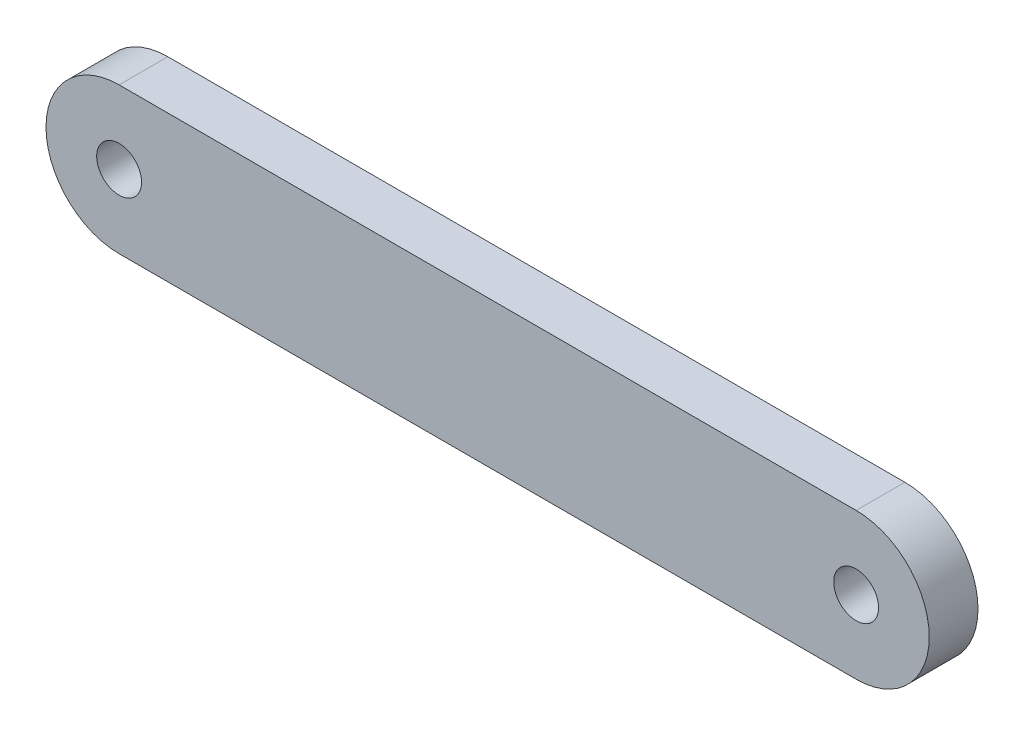
ISO-10303-21;
HEADER;
FILE_DESCRIPTION(('STEP AP214'),'2;1');
FILE_NAME('part.step','',(''),(''),'','','');
FILE_SCHEMA(('AUTOMOTIVE_DESIGN { 1 0 10303 214 1 1 1 1 }'));
ENDSEC;
DATA;
#1=APPLICATION_CONTEXT('core data for automotive mechanical design processes');
#2=APPLICATION_PROTOCOL_DEFINITION('international standard','automotive_design',2000,#1);
#3=PRODUCT_CONTEXT('',#1,'mechanical');
#4=PRODUCT('Part','Part','',(#3));
#5=PRODUCT_RELATED_PRODUCT_CATEGORY('part','',(#4));
#6=PRODUCT_DEFINITION_FORMATION('','',#4);
#7=PRODUCT_DEFINITION_CONTEXT('part definition',#1,'design');
#8=PRODUCT_DEFINITION('design','',#6,#7);
#9=PRODUCT_DEFINITION_SHAPE('','',#8);
#10=(LENGTH_UNIT() NAMED_UNIT(*) SI_UNIT(.MILLI.,.METRE.));
#11=(NAMED_UNIT(*) PLANE_ANGLE_UNIT() SI_UNIT($,.RADIAN.));
#12=(NAMED_UNIT(*) SI_UNIT($,.STERADIAN.) SOLID_ANGLE_UNIT());
#13=UNCERTAINTY_MEASURE_WITH_UNIT(LENGTH_MEASURE(1.E-05),#10,'distance_accuracy_value','');
#14=(GEOMETRIC_REPRESENTATION_CONTEXT(3) GLOBAL_UNCERTAINTY_ASSIGNED_CONTEXT((#13)) GLOBAL_UNIT_ASSIGNED_CONTEXT((#10,
#11,#12)) REPRESENTATION_CONTEXT('',''));
#15=CARTESIAN_POINT('',(0.,0.,0.));
#16=DIRECTION('',(0.,0.,1.));
#17=DIRECTION('',(1.,0.,0.));
#18=AXIS2_PLACEMENT_3D('',#15,#16,#17);
#19=CARTESIAN_POINT('',(37.8,0.,5.));
#20=DIRECTION('',(0.,0.,-1.));
#21=DIRECTION('',(-1.,0.,0.));
#22=AXIS2_PLACEMENT_3D('',#19,#20,#21);
#23=PLANE('',#22);
#24=CARTESIAN_POINT('',(37.8,0.,5.));
#25=DIRECTION('',(0.,0.,1.));
#26=DIRECTION('',(-1.,0.,0.));
#27=AXIS2_PLACEMENT_3D('',#24,#25,#26);
#28=CIRCLE('',#27,7.5);
#29=CARTESIAN_POINT('',(37.8,-7.5,5.));
#30=VERTEX_POINT('',#29);
#31=CARTESIAN_POINT('',(37.8,7.5,5.));
#32=VERTEX_POINT('',#31);
#33=EDGE_CURVE('E87',#30,#32,#28,.T.);
#34=ORIENTED_EDGE('',*,*,#33,.T.);
#35=DIRECTION('',(-1.,0.,0.));
#36=VECTOR('',#35,1.);
#37=CARTESIAN_POINT('',(-37.8,7.5,5.));
#38=LINE('',#37,#36);
#39=CARTESIAN_POINT('',(-37.8,7.5,5.));
#40=VERTEX_POINT('',#39);
#41=EDGE_CURVE('E82',#32,#40,#38,.T.);
#42=ORIENTED_EDGE('',*,*,#41,.T.);
#43=CARTESIAN_POINT('',(-37.8,0.,5.));
#44=DIRECTION('',(0.,0.,1.));
#45=DIRECTION('',(1.,0.,0.));
#46=AXIS2_PLACEMENT_3D('',#43,#44,#45);
#47=CIRCLE('',#46,7.5);
#48=CARTESIAN_POINT('',(-37.8,-7.5,5.));
#49=VERTEX_POINT('',#48);
#50=EDGE_CURVE('E85',#40,#49,#47,.T.);
#51=ORIENTED_EDGE('',*,*,#50,.T.);
#52=DIRECTION('',(1.,0.,0.));
#53=VECTOR('',#52,1.);
#54=CARTESIAN_POINT('',(-37.8,-7.5,5.));
#55=LINE('',#54,#53);
#56=EDGE_CURVE('E52',#49,#30,#55,.T.);
#57=ORIENTED_EDGE('',*,*,#56,.T.);
#58=EDGE_LOOP('',(#34,#42,#51,#57));
#59=FACE_BOUND('',#58,.T.);
#60=CARTESIAN_POINT('',(-37.8,0.,5.));
#61=DIRECTION('',(0.,0.,1.));
#62=DIRECTION('',(1.,0.,0.));
#63=AXIS2_PLACEMENT_3D('',#60,#61,#62);
#64=CIRCLE('',#63,2.29999999999999);
#65=CARTESIAN_POINT('',(-35.5,0.,5.));
#66=VERTEX_POINT('',#65);
#67=EDGE_CURVE('E102',#66,#66,#64,.T.);
#68=ORIENTED_EDGE('',*,*,#67,.F.);
#69=EDGE_LOOP('',(#68));
#70=FACE_BOUND('',#69,.T.);
#71=CARTESIAN_POINT('',(37.8,0.,5.));
#72=DIRECTION('',(0.,0.,1.));
#73=DIRECTION('',(1.,0.,0.));
#74=AXIS2_PLACEMENT_3D('',#71,#72,#73);
#75=CIRCLE('',#74,2.30000000000001);
#76=CARTESIAN_POINT('',(40.1,0.,5.));
#77=VERTEX_POINT('',#76);
#78=EDGE_CURVE('E117',#77,#77,#75,.T.);
#79=ORIENTED_EDGE('',*,*,#78,.F.);
#80=EDGE_LOOP('',(#79));
#81=FACE_BOUND('',#80,.T.);
#82=ADVANCED_FACE('F35',(#59,#70,#81),#23,.F.);
#83=CARTESIAN_POINT('',(37.8,0.,0.));
#84=DIRECTION('',(0.,0.,-1.));
#85=DIRECTION('',(-1.,0.,0.));
#86=AXIS2_PLACEMENT_3D('',#83,#84,#85);
#87=PLANE('',#86);
#88=CARTESIAN_POINT('',(-37.8,0.,0.));
#89=DIRECTION('',(0.,0.,1.));
#90=DIRECTION('',(1.,0.,0.));
#91=AXIS2_PLACEMENT_3D('',#88,#89,#90);
#92=CIRCLE('',#91,2.29999999999999);
#93=CARTESIAN_POINT('',(-35.5,0.,0.));
#94=VERTEX_POINT('',#93);
#95=EDGE_CURVE('E114',#94,#94,#92,.T.);
#96=ORIENTED_EDGE('',*,*,#95,.T.);
#97=EDGE_LOOP('',(#96));
#98=FACE_BOUND('',#97,.T.);
#99=CARTESIAN_POINT('',(37.8,0.,0.));
#100=DIRECTION('',(0.,0.,1.));
#101=DIRECTION('',(-1.,0.,0.));
#102=AXIS2_PLACEMENT_3D('',#99,#100,#101);
#103=CIRCLE('',#102,7.5);
#104=CARTESIAN_POINT('',(37.8,-7.5,0.));
#105=VERTEX_POINT('',#104);
#106=CARTESIAN_POINT('',(37.8,7.5,0.));
#107=VERTEX_POINT('',#106);
#108=EDGE_CURVE('E99',#105,#107,#103,.T.);
#109=ORIENTED_EDGE('',*,*,#108,.F.);
#110=DIRECTION('',(1.,0.,0.));
#111=VECTOR('',#110,1.);
#112=CARTESIAN_POINT('',(-37.8,-7.5,0.));
#113=LINE('',#112,#111);
#114=CARTESIAN_POINT('',(-37.8,-7.5,0.));
#115=VERTEX_POINT('',#114);
#116=EDGE_CURVE('E75',#115,#105,#113,.T.);
#117=ORIENTED_EDGE('',*,*,#116,.F.);
#118=CARTESIAN_POINT('',(-37.8,0.,0.));
#119=DIRECTION('',(0.,0.,1.));
#120=DIRECTION('',(1.,0.,0.));
#121=AXIS2_PLACEMENT_3D('',#118,#119,#120);
#122=CIRCLE('',#121,7.5);
#123=CARTESIAN_POINT('',(-37.8,7.5,0.));
#124=VERTEX_POINT('',#123);
#125=EDGE_CURVE('E69',#124,#115,#122,.T.);
#126=ORIENTED_EDGE('',*,*,#125,.F.);
#127=DIRECTION('',(-1.,0.,0.));
#128=VECTOR('',#127,1.);
#129=CARTESIAN_POINT('',(-37.8,7.5,0.));
#130=LINE('',#129,#128);
#131=EDGE_CURVE('E91',#107,#124,#130,.T.);
#132=ORIENTED_EDGE('',*,*,#131,.F.);
#133=EDGE_LOOP('',(#109,#117,#126,#132));
#134=FACE_BOUND('',#133,.T.);
#135=CARTESIAN_POINT('',(37.8,0.,0.));
#136=DIRECTION('',(0.,0.,1.));
#137=DIRECTION('',(1.,0.,0.));
#138=AXIS2_PLACEMENT_3D('',#135,#136,#137);
#139=CIRCLE('',#138,2.30000000000001);
#140=CARTESIAN_POINT('',(40.1,0.,0.));
#141=VERTEX_POINT('',#140);
#142=EDGE_CURVE('E120',#141,#141,#139,.T.);
#143=ORIENTED_EDGE('',*,*,#142,.T.);
#144=EDGE_LOOP('',(#143));
#145=FACE_BOUND('',#144,.T.);
#146=ADVANCED_FACE('F110',(#98,#134,#145),#87,.T.);
#147=CARTESIAN_POINT('',(37.8,0.,5.));
#148=DIRECTION('',(0.,0.,-1.));
#149=DIRECTION('',(-1.,0.,0.));
#150=AXIS2_PLACEMENT_3D('',#147,#148,#149);
#151=CYLINDRICAL_SURFACE('',#150,7.5);
#152=ORIENTED_EDGE('',*,*,#108,.T.);
#153=DIRECTION('',(0.,0.,-1.));
#154=VECTOR('',#153,1.);
#155=CARTESIAN_POINT('',(37.8,7.5,5.));
#156=LINE('',#155,#154);
#157=EDGE_CURVE('E11',#32,#107,#156,.T.);
#158=ORIENTED_EDGE('',*,*,#157,.F.);
#159=ORIENTED_EDGE('',*,*,#33,.F.);
#160=DIRECTION('',(0.,0.,-1.));
#161=VECTOR('',#160,1.);
#162=CARTESIAN_POINT('',(37.8,-7.5,5.));
#163=LINE('',#162,#161);
#164=EDGE_CURVE('E95',#30,#105,#163,.T.);
#165=ORIENTED_EDGE('',*,*,#164,.T.);
#166=EDGE_LOOP('',(#152,#158,#159,#165));
#167=FACE_BOUND('',#166,.T.);
#168=ADVANCED_FACE('F37',(#167),#151,.T.);
#169=CARTESIAN_POINT('',(-37.8,7.5,5.));
#170=DIRECTION('',(0.,-1.,0.));
#171=DIRECTION('',(0.,0.,-1.));
#172=AXIS2_PLACEMENT_3D('',#169,#170,#171);
#173=PLANE('',#172);
#174=ORIENTED_EDGE('',*,*,#131,.T.);
#175=DIRECTION('',(0.,0.,-1.));
#176=VECTOR('',#175,1.);
#177=CARTESIAN_POINT('',(-37.8,7.5,5.));
#178=LINE('',#177,#176);
#179=EDGE_CURVE('E44',#40,#124,#178,.T.);
#180=ORIENTED_EDGE('',*,*,#179,.F.);
#181=ORIENTED_EDGE('',*,*,#41,.F.);
#182=ORIENTED_EDGE('',*,*,#157,.T.);
#183=EDGE_LOOP('',(#174,#180,#181,#182));
#184=FACE_BOUND('',#183,.T.);
#185=ADVANCED_FACE('F90',(#184),#173,.F.);
#186=CARTESIAN_POINT('',(-37.8,0.,5.));
#187=DIRECTION('',(0.,0.,-1.));
#188=DIRECTION('',(-1.,0.,0.));
#189=AXIS2_PLACEMENT_3D('',#186,#187,#188);
#190=CYLINDRICAL_SURFACE('',#189,7.5);
#191=ORIENTED_EDGE('',*,*,#125,.T.);
#192=DIRECTION('',(0.,0.,-1.));
#193=VECTOR('',#192,1.);
#194=CARTESIAN_POINT('',(-37.8,-7.5,5.));
#195=LINE('',#194,#193);
#196=EDGE_CURVE('E92',#49,#115,#195,.T.);
#197=ORIENTED_EDGE('',*,*,#196,.F.);
#198=ORIENTED_EDGE('',*,*,#50,.F.);
#199=ORIENTED_EDGE('',*,*,#179,.T.);
#200=EDGE_LOOP('',(#191,#197,#198,#199));
#201=FACE_BOUND('',#200,.T.);
#202=ADVANCED_FACE('F93',(#201),#190,.T.);
#203=CARTESIAN_POINT('',(-37.8,-7.5,5.));
#204=DIRECTION('',(0.,1.,0.));
#205=DIRECTION('',(0.,0.,1.));
#206=AXIS2_PLACEMENT_3D('',#203,#204,#205);
#207=PLANE('',#206);
#208=ORIENTED_EDGE('',*,*,#116,.T.);
#209=ORIENTED_EDGE('',*,*,#164,.F.);
#210=ORIENTED_EDGE('',*,*,#56,.F.);
#211=ORIENTED_EDGE('',*,*,#196,.T.);
#212=EDGE_LOOP('',(#208,#209,#210,#211));
#213=FACE_BOUND('',#212,.T.);
#214=ADVANCED_FACE('F107',(#213),#207,.F.);
#215=CARTESIAN_POINT('',(-37.8,0.,5.));
#216=DIRECTION('',(0.,0.,-1.));
#217=DIRECTION('',(-1.,0.,0.));
#218=AXIS2_PLACEMENT_3D('',#215,#216,#217);
#219=CYLINDRICAL_SURFACE('',#218,2.29999999999999);
#220=ORIENTED_EDGE('',*,*,#67,.T.);
#221=EDGE_LOOP('',(#220));
#222=FACE_BOUND('',#221,.T.);
#223=ORIENTED_EDGE('',*,*,#95,.F.);
#224=EDGE_LOOP('',(#223));
#225=FACE_BOUND('',#224,.T.);
#226=ADVANCED_FACE('F137',(#222,#225),#219,.F.);
#227=CARTESIAN_POINT('',(37.8,0.,5.));
#228=DIRECTION('',(0.,0.,-1.));
#229=DIRECTION('',(-1.,0.,0.));
#230=AXIS2_PLACEMENT_3D('',#227,#228,#229);
#231=CYLINDRICAL_SURFACE('',#230,2.30000000000001);
#232=ORIENTED_EDGE('',*,*,#78,.T.);
#233=EDGE_LOOP('',(#232));
#234=FACE_BOUND('',#233,.T.);
#235=ORIENTED_EDGE('',*,*,#142,.F.);
#236=EDGE_LOOP('',(#235));
#237=FACE_BOUND('',#236,.T.);
#238=ADVANCED_FACE('F126',(#234,#237),#231,.F.);
#239=CLOSED_SHELL('',(#82,#146,#168,#185,#202,#214,#226,#238));
#240=MANIFOLD_SOLID_BREP('B2',#239);
#241=ADVANCED_BREP_SHAPE_REPRESENTATION('',(#18,#240),#14);
#242=SHAPE_DEFINITION_REPRESENTATION(#9,#241);
ENDSEC;
END-ISO-10303-21;
